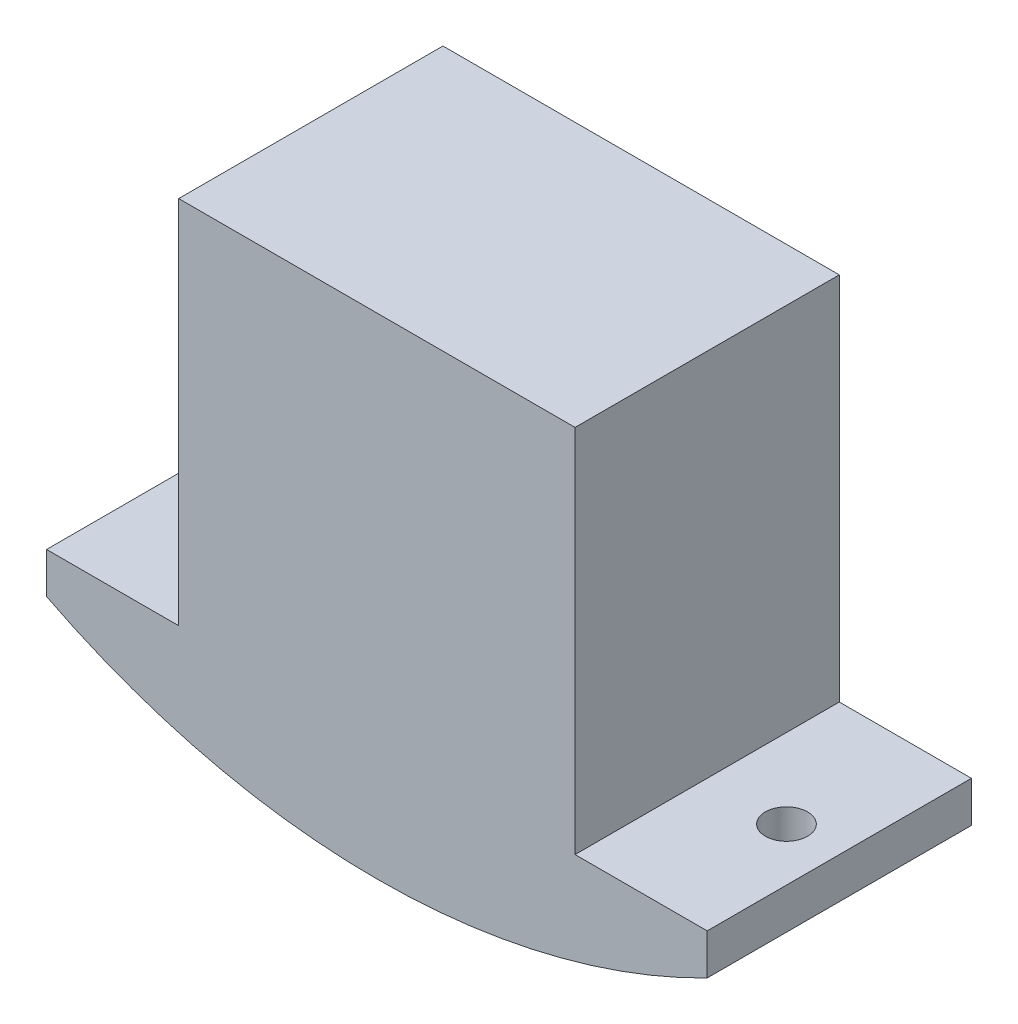
ISO-10303-21;
HEADER;
FILE_DESCRIPTION(('STEP AP214'),'2;1');
FILE_NAME('part.step','',(''),(''),'','','');
FILE_SCHEMA(('AUTOMOTIVE_DESIGN { 1 0 10303 214 1 1 1 1 }'));
ENDSEC;
DATA;
#1=APPLICATION_CONTEXT('core data for automotive mechanical design processes');
#2=APPLICATION_PROTOCOL_DEFINITION('international standard','automotive_design',2000,#1);
#3=PRODUCT_CONTEXT('',#1,'mechanical');
#4=PRODUCT('Part','Part','',(#3));
#5=PRODUCT_RELATED_PRODUCT_CATEGORY('part','',(#4));
#6=PRODUCT_DEFINITION_FORMATION('','',#4);
#7=PRODUCT_DEFINITION_CONTEXT('part definition',#1,'design');
#8=PRODUCT_DEFINITION('design','',#6,#7);
#9=PRODUCT_DEFINITION_SHAPE('','',#8);
#10=(LENGTH_UNIT() NAMED_UNIT(*) SI_UNIT(.MILLI.,.METRE.));
#11=(NAMED_UNIT(*) PLANE_ANGLE_UNIT() SI_UNIT($,.RADIAN.));
#12=(NAMED_UNIT(*) SI_UNIT($,.STERADIAN.) SOLID_ANGLE_UNIT());
#13=UNCERTAINTY_MEASURE_WITH_UNIT(LENGTH_MEASURE(1.E-05),#10,'distance_accuracy_value','');
#14=(GEOMETRIC_REPRESENTATION_CONTEXT(3) GLOBAL_UNCERTAINTY_ASSIGNED_CONTEXT((#13)) GLOBAL_UNIT_ASSIGNED_CONTEXT((#10,
#11,#12)) REPRESENTATION_CONTEXT('',''));
#15=CARTESIAN_POINT('',(0.,0.,0.));
#16=DIRECTION('',(0.,0.,1.));
#17=DIRECTION('',(1.,0.,0.));
#18=AXIS2_PLACEMENT_3D('',#15,#16,#17);
#19=CARTESIAN_POINT('',(-25.,-45.8997948556636,20.));
#20=DIRECTION('',(0.,-1.,0.));
#21=DIRECTION('',(0.,0.,-1.));
#22=AXIS2_PLACEMENT_3D('',#19,#20,#21);
#23=PLANE('',#22);
#24=CARTESIAN_POINT('',(-21.,-45.8997948556636,10.));
#25=DIRECTION('',(0.,1.,0.));
#26=DIRECTION('',(0.,0.,1.));
#27=AXIS2_PLACEMENT_3D('',#24,#25,#26);
#28=CIRCLE('',#27,1.6);
#29=CARTESIAN_POINT('',(-21.,-45.8997948556636,11.6));
#30=VERTEX_POINT('',#29);
#31=EDGE_CURVE('E132',#30,#30,#28,.T.);
#32=ORIENTED_EDGE('',*,*,#31,.F.);
#33=EDGE_LOOP('',(#32));
#34=FACE_BOUND('',#33,.T.);
#35=DIRECTION('',(-1.,0.,0.));
#36=VECTOR('',#35,1.);
#37=CARTESIAN_POINT('',(-25.,-45.8997948556636,0.));
#38=LINE('',#37,#36);
#39=CARTESIAN_POINT('',(-15.,-45.8997948556636,0.));
#40=VERTEX_POINT('',#39);
#41=CARTESIAN_POINT('',(-25.,-45.8997948556636,0.));
#42=VERTEX_POINT('',#41);
#43=EDGE_CURVE('E128',#40,#42,#38,.T.);
#44=ORIENTED_EDGE('',*,*,#43,.T.);
#45=DIRECTION('',(0.,0.,-1.));
#46=VECTOR('',#45,1.);
#47=CARTESIAN_POINT('',(-25.,-45.8997948556636,20.));
#48=LINE('',#47,#46);
#49=CARTESIAN_POINT('',(-25.,-45.8997948556636,20.));
#50=VERTEX_POINT('',#49);
#51=EDGE_CURVE('E11',#50,#42,#48,.T.);
#52=ORIENTED_EDGE('',*,*,#51,.F.);
#53=DIRECTION('',(-1.,0.,0.));
#54=VECTOR('',#53,1.);
#55=CARTESIAN_POINT('',(-25.,-45.8997948556636,20.));
#56=LINE('',#55,#54);
#57=CARTESIAN_POINT('',(-15.,-45.8997948556636,20.));
#58=VERTEX_POINT('',#57);
#59=EDGE_CURVE('E143',#58,#50,#56,.T.);
#60=ORIENTED_EDGE('',*,*,#59,.F.);
#61=DIRECTION('',(0.,0.,-1.));
#62=VECTOR('',#61,1.);
#63=CARTESIAN_POINT('',(-15.,-45.8997948556636,20.));
#64=LINE('',#63,#62);
#65=EDGE_CURVE('E124',#58,#40,#64,.T.);
#66=ORIENTED_EDGE('',*,*,#65,.T.);
#67=EDGE_LOOP('',(#44,#52,#60,#66));
#68=FACE_BOUND('',#67,.T.);
#69=ADVANCED_FACE('F32',(#34,#68),#23,.F.);
#70=CARTESIAN_POINT('',(-25.,-48.9897948556636,20.));
#71=DIRECTION('',(1.,0.,0.));
#72=DIRECTION('',(0.,0.,-1.));
#73=AXIS2_PLACEMENT_3D('',#70,#71,#72);
#74=PLANE('',#73);
#75=DIRECTION('',(0.,-1.,0.));
#76=VECTOR('',#75,1.);
#77=CARTESIAN_POINT('',(-25.,-48.9897948556636,0.));
#78=LINE('',#77,#76);
#79=CARTESIAN_POINT('',(-25.,-48.9897948556636,0.));
#80=VERTEX_POINT('',#79);
#81=EDGE_CURVE('E131',#42,#80,#78,.T.);
#82=ORIENTED_EDGE('',*,*,#81,.T.);
#83=DIRECTION('',(0.,0.,-1.));
#84=VECTOR('',#83,1.);
#85=CARTESIAN_POINT('',(-25.,-48.9897948556636,20.));
#86=LINE('',#85,#84);
#87=CARTESIAN_POINT('',(-25.,-48.9897948556636,20.));
#88=VERTEX_POINT('',#87);
#89=EDGE_CURVE('E40',#88,#80,#86,.T.);
#90=ORIENTED_EDGE('',*,*,#89,.F.);
#91=DIRECTION('',(0.,-1.,0.));
#92=VECTOR('',#91,1.);
#93=CARTESIAN_POINT('',(-25.,-48.9897948556636,20.));
#94=LINE('',#93,#92);
#95=EDGE_CURVE('E91',#50,#88,#94,.T.);
#96=ORIENTED_EDGE('',*,*,#95,.F.);
#97=ORIENTED_EDGE('',*,*,#51,.T.);
#98=EDGE_LOOP('',(#82,#90,#96,#97));
#99=FACE_BOUND('',#98,.T.);
#100=ADVANCED_FACE('F220',(#99),#74,.F.);
#101=CARTESIAN_POINT('',(0.,0.,20.));
#102=DIRECTION('',(0.,0.,-1.));
#103=DIRECTION('',(-1.,0.,0.));
#104=AXIS2_PLACEMENT_3D('',#101,#102,#103);
#105=CYLINDRICAL_SURFACE('',#104,55.);
#106=CARTESIAN_POINT('',(-21.,-50.8330601085553,13.1));
#107=CARTESIAN_POINT('',(-21.1880005553316,-50.7553920460335,13.0999933044631));
#108=CARTESIAN_POINT('',(-21.3757249316982,-50.676607673479,13.0828603278134));
#109=CARTESIAN_POINT('',(-21.7452902366741,-50.5191335969547,13.0149528232306));
#110=CARTESIAN_POINT('',(-21.9271212239294,-50.4404442486739,12.9641242679141));
#111=CARTESIAN_POINT('',(-22.2796942671875,-50.2857065967124,12.8298351191533));
#112=CARTESIAN_POINT('',(-22.4504309833981,-50.2096595728846,12.746358945753));
#113=CARTESIAN_POINT('',(-22.7754484118285,-50.0630676909033,12.5483272717249));
#114=CARTESIAN_POINT('',(-22.9297355686794,-49.9925206808795,12.4337840054007));
#115=CARTESIAN_POINT('',(-23.212059127198,-49.8620475820851,12.1798449291502));
#116=CARTESIAN_POINT('',(-23.3407566596687,-49.8018616784679,12.0413212778889));
#117=CARTESIAN_POINT('',(-23.5723931508888,-49.6926425659666,11.7403396024859));
#118=CARTESIAN_POINT('',(-23.6753475366772,-49.6436026792449,11.5778960059923));
#119=CARTESIAN_POINT('',(-23.8425829556854,-49.5634855135644,11.2492472554569));
#120=CARTESIAN_POINT('',(-23.9095026733124,-49.5311924458572,11.0846834004291));
#121=CARTESIAN_POINT('',(-24.0144911163199,-49.4803766732872,10.7446054441459));
#122=CARTESIAN_POINT('',(-24.0525815423907,-49.4618436110474,10.5690996871245));
#123=CARTESIAN_POINT('',(-24.0957366151136,-49.4408331353126,10.2299366462524));
#124=CARTESIAN_POINT('',(-24.1035588981344,-49.4370152162986,10.0667080514063));
#125=CARTESIAN_POINT('',(-24.0934665362528,-49.441934714723,9.74126128598989));
#126=CARTESIAN_POINT('',(-24.0755581338245,-49.4506690868734,9.57904287992798));
#127=CARTESIAN_POINT('',(-24.0159446414232,-49.479646613924,9.26613029177188));
#128=CARTESIAN_POINT('',(-23.9750996499539,-49.4994737087949,9.11523145100215));
#129=CARTESIAN_POINT('',(-23.8719614516461,-49.549295813995,8.82276067394915));
#130=CARTESIAN_POINT('',(-23.8096655826953,-49.5792920863396,8.68118989790329));
#131=CARTESIAN_POINT('',(-23.6630242970063,-49.6494523551362,8.40510056384761));
#132=CARTESIAN_POINT('',(-23.5778971647339,-49.6899747965998,8.27108996947782));
#133=CARTESIAN_POINT('',(-23.3897864497861,-49.778797669364,8.0191769509117));
#134=CARTESIAN_POINT('',(-23.2867968924547,-49.8271007027444,7.90127994008338));
#135=CARTESIAN_POINT('',(-23.0562537758771,-49.9342232694621,7.67400624722809));
#136=CARTESIAN_POINT('',(-22.9273416735422,-49.9935924510506,7.56626759201561));
#137=CARTESIAN_POINT('',(-22.6555304033656,-50.1173548685673,7.37378895941099));
#138=CARTESIAN_POINT('',(-22.5126255738565,-50.1817501359695,7.28905834417299));
#139=CARTESIAN_POINT('',(-22.2029708666222,-50.3195714361675,7.13727555861048));
#140=CARTESIAN_POINT('',(-22.0352323854852,-50.3932887430233,7.07249939089997));
#141=CARTESIAN_POINT('',(-21.6916687208698,-50.5421268436343,6.97285430707471));
#142=CARTESIAN_POINT('',(-21.5158409322286,-50.6172480848359,6.93799509776872));
#143=CARTESIAN_POINT('',(-21.1513760195531,-50.7706638671181,6.89800426659675));
#144=CARTESIAN_POINT('',(-20.9625442389504,-50.8489237298817,6.89448773833377));
#145=CARTESIAN_POINT('',(-20.5861436227394,-51.0024706492462,6.92196009852178));
#146=CARTESIAN_POINT('',(-20.3985748551457,-51.0777575467952,6.95295083051037));
#147=CARTESIAN_POINT('',(-20.0316809334992,-51.2227528069683,7.04905742498432));
#148=CARTESIAN_POINT('',(-19.8523075140372,-51.2924963298674,7.11393442260001));
#149=CARTESIAN_POINT('',(-19.5064467663301,-51.4250214628812,7.27680349871263));
#150=CARTESIAN_POINT('',(-19.3399557530705,-51.4878050661223,7.37478606399608));
#151=CARTESIAN_POINT('',(-19.0344005153011,-51.6015195567654,7.59581927967318));
#152=CARTESIAN_POINT('',(-18.8943535429527,-51.6529005814896,7.71727761166198));
#153=CARTESIAN_POINT('',(-18.636793285317,-51.7463886703328,7.98512406303934));
#154=CARTESIAN_POINT('',(-18.5192703646194,-51.7884997011497,8.13150147163716));
#155=CARTESIAN_POINT('',(-18.3186122832657,-51.8598020141061,8.43444861314598));
#156=CARTESIAN_POINT('',(-18.233706623123,-51.889667572203,8.58968780535117));
#157=CARTESIAN_POINT('',(-18.0911829716268,-51.939530614033,8.91369009464537));
#158=CARTESIAN_POINT('',(-18.0335554983919,-51.9595315268124,9.08244846859039));
#159=CARTESIAN_POINT('',(-17.9502357354832,-51.9883726036303,9.41911323616182));
#160=CARTESIAN_POINT('',(-17.9230275300034,-51.9977429334181,9.58660042013892));
#161=CARTESIAN_POINT('',(-17.8963166342662,-52.0069424597295,9.92401890421695));
#162=CARTESIAN_POINT('',(-17.8968089300155,-52.0067733829554,10.093949756429));
#163=CARTESIAN_POINT('',(-17.9251193153286,-51.9970220179387,10.4270548517473));
#164=CARTESIAN_POINT('',(-17.9522728442856,-51.9876686577681,10.5902929240702));
#165=CARTESIAN_POINT('',(-18.031906183117,-51.9601012066274,10.9096730841036));
#166=CARTESIAN_POINT('',(-18.0843857233914,-51.9418872099803,11.065815247332));
#167=CARTESIAN_POINT('',(-18.2132048538323,-51.8968575730114,11.3678092060371));
#168=CARTESIAN_POINT('',(-18.2896995227267,-51.8699859955174,11.5135863430243));
#169=CARTESIAN_POINT('',(-18.4637783400796,-51.8082752988828,11.7900488465414));
#170=CARTESIAN_POINT('',(-18.5613641372207,-51.7734355568625,11.9207330320371));
#171=CARTESIAN_POINT('',(-18.7781724725445,-51.695202294207,12.1682903556516));
#172=CARTESIAN_POINT('',(-18.8980272767727,-51.6515543314649,12.2845284740939));
#173=CARTESIAN_POINT('',(-19.1531815384227,-51.5574835852272,12.4953301218378));
#174=CARTESIAN_POINT('',(-19.2884883813723,-51.5070575600019,12.5898832209692));
#175=CARTESIAN_POINT('',(-19.5785844427872,-51.397513376809,12.7603366758791));
#176=CARTESIAN_POINT('',(-19.7340419750428,-51.3380654473083,12.8348848480948));
#177=CARTESIAN_POINT('',(-20.0532357042321,-51.2142262627779,12.9568212882241));
#178=CARTESIAN_POINT('',(-20.2169646235016,-51.1498393283834,13.0042329946312));
#179=CARTESIAN_POINT('',(-20.4846278585339,-51.0430420149682,13.0586330566419));
#180=CARTESIAN_POINT('',(-20.587339651689,-51.0017038893481,13.07415530034));
#181=CARTESIAN_POINT('',(-20.7933954003077,-50.918042806554,13.0948406410067));
#182=CARTESIAN_POINT('',(-20.8967393594538,-50.8757198436388,13.1000036775712));
#183=CARTESIAN_POINT('',(-21.,-50.8330601085553,13.1));
#184=B_SPLINE_CURVE_WITH_KNOTS('',3,(#106,#107,#108,#109,#110,#111,#112,#113,#114,#115,#116,
#117,#118,#119,#120,#121,#122,#123,#124,#125,#126,#127,#128,#129,#130,#131,#132,#133,#134,#135,
#136,#137,#138,#139,#140,#141,#142,#143,#144,#145,#146,#147,#148,#149,#150,#151,#152,#153,#154,
#155,#156,#157,#158,#159,#160,#161,#162,#163,#164,#165,#166,#167,#168,#169,#170,#171,#172,#173,
#174,#175,#176,#177,#178,#179,#180,#181,#182,#183),.UNSPECIFIED.,.T.,.F.,(4,2,2,2,2,2,2,2,2,2,2,
2,2,2,2,2,2,2,2,2,2,2,2,2,2,2,2,2,2,2,2,2,2,2,2,2,2,2,4),(0.,0.609831568960383,1.22064331257064,
1.83174690150622,2.44261018476417,3.03469640998915,3.62642696200632,4.1651359314897,
4.7034389938409,5.19135414318091,5.67915094031112,6.14977211438869,6.62045171489747,
7.10994214682858,7.59959662126277,8.13192512186627,8.66446990767516,9.24492147859417,
9.82556131078311,10.4359588446578,11.0463889903597,11.6525731438991,12.2585832523469,
12.8326719641952,13.4065145397022,13.9420915540091,14.4774822651092,14.9848031323611,
15.4920321711206,15.986930849839,16.4818242603881,16.9799815836662,17.4781778617371,
17.9936271521462,18.5093238484259,19.054095270067,19.598395445178,19.9333478135046,
20.2683021349165),.UNSPECIFIED.);
#185=CARTESIAN_POINT('',(-21.,-50.8330601085553,13.1));
#186=VERTEX_POINT('',#185);
#187=EDGE_CURVE('E187',#186,#186,#184,.T.);
#188=ORIENTED_EDGE('',*,*,#187,.F.);
#189=EDGE_LOOP('',(#188));
#190=FACE_BOUND('',#189,.T.);
#191=CARTESIAN_POINT('',(21.,-50.8330601085553,13.1));
#192=CARTESIAN_POINT('',(20.8177146204358,-50.9083637547193,13.0999938373069));
#193=CARTESIAN_POINT('',(20.6348977223595,-50.9827306898791,13.0838901418377));
#194=CARTESIAN_POINT('',(20.273311622882,-51.1275940003155,13.019223263897));
#195=CARTESIAN_POINT('',(20.0945468716768,-51.1980862308243,12.9706260272636));
#196=CARTESIAN_POINT('',(19.7462539582834,-51.3334239956548,12.8412462182303));
#197=CARTESIAN_POINT('',(19.5767444761655,-51.398258257448,12.7604011047474));
#198=CARTESIAN_POINT('',(19.2531997896221,-51.5203281509274,12.567895683877));
#199=CARTESIAN_POINT('',(19.0991575642722,-51.5775672340586,12.4562494448284));
#200=CARTESIAN_POINT('',(18.8194422838864,-51.680264600876,12.2108973796841));
#201=CARTESIAN_POINT('',(18.6927488472437,-51.7261627813463,12.0785409031254));
#202=CARTESIAN_POINT('',(18.4635813712355,-51.8084069272884,11.7917127159057));
#203=CARTESIAN_POINT('',(18.3610983324015,-51.8447564427463,11.6372492572277));
#204=CARTESIAN_POINT('',(18.1904039179595,-51.9048831441195,11.3214690785874));
#205=CARTESIAN_POINT('',(18.1204019648644,-51.9293224229049,11.1612451814627));
#206=CARTESIAN_POINT('',(18.0081397201886,-51.9683603028427,10.8302309727614));
#207=CARTESIAN_POINT('',(17.9658707731008,-51.9829619743632,10.659443976169));
#208=CARTESIAN_POINT('',(17.9120769014418,-52.0015218319718,10.3206268955279));
#209=CARTESIAN_POINT('',(17.8992283009696,-52.0059383375317,10.1528308445719));
#210=CARTESIAN_POINT('',(17.9008431792208,-52.0053825948392,9.81739748649115));
#211=CARTESIAN_POINT('',(17.9153028798965,-52.0004116453222,9.64976016061732));
#212=CARTESIAN_POINT('',(17.970511345467,-51.9813576141218,9.32226146213378));
#213=CARTESIAN_POINT('',(18.0108260432156,-51.9674249747952,9.1623177337564));
#214=CARTESIAN_POINT('',(18.1158499412313,-51.9309064957742,8.85171524524056));
#215=CARTESIAN_POINT('',(18.1805597175655,-51.9083204517373,8.70105670446097));
#216=CARTESIAN_POINT('',(18.3331839284378,-51.8546138040551,8.41086493695801));
#217=CARTESIAN_POINT('',(18.4214149994431,-51.8233764980107,8.2715201971099));
#218=CARTESIAN_POINT('',(18.6176423966222,-51.7532049633925,8.00973693938558));
#219=CARTESIAN_POINT('',(18.7256417595163,-51.7142695521949,7.88730102404757));
#220=CARTESIAN_POINT('',(18.9627977469742,-51.6277913435134,7.6573101133388));
#221=CARTESIAN_POINT('',(19.0926407271465,-51.5799608934124,7.55057197230411));
#222=CARTESIAN_POINT('',(19.3660678540002,-51.4779244636859,7.36029695277776));
#223=CARTESIAN_POINT('',(19.5096554355556,-51.4237168895926,7.27676589436162));
#224=CARTESIAN_POINT('',(19.8154137569849,-51.3067022526693,7.12994882244971));
#225=CARTESIAN_POINT('',(19.9781818196429,-51.2435754848166,7.06816232115972));
#226=CARTESIAN_POINT('',(20.3100893508858,-51.1129348411333,6.97281221912019));
#227=CARTESIAN_POINT('',(20.4792307311093,-51.0454196445455,6.93925715776968));
#228=CARTESIAN_POINT('',(20.8301791372671,-50.9032575479516,6.89931464175235));
#229=CARTESIAN_POINT('',(21.0121200838805,-50.8284281862208,6.89474496400945));
#230=CARTESIAN_POINT('',(21.3735287632949,-50.6775163285057,6.91726061301757));
#231=CARTESIAN_POINT('',(21.5529957749111,-50.6014334807324,6.94435498074311));
#232=CARTESIAN_POINT('',(21.9118336682774,-50.44711256262,7.03116781229566));
#233=CARTESIAN_POINT('',(22.0909185029272,-50.3689086740101,7.09213742031164));
#234=CARTESIAN_POINT('',(22.4363239117846,-50.2160041258121,7.2463216430235));
#235=CARTESIAN_POINT('',(22.602643044644,-50.1413038621802,7.33953989232021));
#236=CARTESIAN_POINT('',(22.915373835001,-49.9991482180977,7.55521159032609));
#237=CARTESIAN_POINT('',(23.0619978384442,-49.9316175448822,7.67730591111091));
#238=CARTESIAN_POINT('',(23.332228931922,-49.8059166253258,7.94882038991483));
#239=CARTESIAN_POINT('',(23.4558464650816,-49.7477421336526,8.09822808846115));
#240=CARTESIAN_POINT('',(23.6664644223678,-49.6478708831381,8.40861615614873));
#241=CARTESIAN_POINT('',(23.7554966648062,-49.6052737298762,8.56792367820013));
#242=CARTESIAN_POINT('',(23.9048797642091,-49.5334599655669,8.90222676033077));
#243=CARTESIAN_POINT('',(23.9652544384652,-49.5042322439275,9.077209148735));
#244=CARTESIAN_POINT('',(24.0496010373927,-49.4633062578903,9.41884550480504));
#245=CARTESIAN_POINT('',(24.0766146392171,-49.4501448521164,9.58457683560136));
#246=CARTESIAN_POINT('',(24.103457217653,-49.4370670415841,9.91872217480521));
#247=CARTESIAN_POINT('',(24.1032975385977,-49.4371451095946,10.0871350343629));
#248=CARTESIAN_POINT('',(24.0766619617946,-49.4501215513358,10.411060908857));
#249=CARTESIAN_POINT('',(24.0517732425367,-49.4622467083548,10.5667394960989));
#250=CARTESIAN_POINT('',(23.9791397764522,-49.497499626361,10.8713453962786));
#251=CARTESIAN_POINT('',(23.9313944841634,-49.5206276499267,11.0202725480036));
#252=CARTESIAN_POINT('',(23.8140626309036,-49.5771590305628,11.3099052598458));
#253=CARTESIAN_POINT('',(23.7441484533049,-49.6107163559399,11.4504472600299));
#254=CARTESIAN_POINT('',(23.5852685545045,-49.68644516298,11.7177248259096));
#255=CARTESIAN_POINT('',(23.4962983657449,-49.7286186645423,11.8444571434848));
#256=CARTESIAN_POINT('',(23.2947154026186,-49.8233832800688,12.0908090822915));
#257=CARTESIAN_POINT('',(23.1808259490629,-49.8765200546143,12.2091723280897));
#258=CARTESIAN_POINT('',(22.9375587444067,-49.9888623021631,12.4253619042037));
#259=CARTESIAN_POINT('',(22.8081712560649,-50.0480715870629,12.5231752158289));
#260=CARTESIAN_POINT('',(22.5243799124363,-50.1764762873152,12.7050495703799));
#261=CARTESIAN_POINT('',(22.368767375975,-50.2460864192683,12.7869317126073));
#262=CARTESIAN_POINT('',(22.0471794406559,-50.3880214590645,12.9229895658875));
#263=CARTESIAN_POINT('',(21.8812116213038,-50.4603443661916,12.9771852810341));
#264=CARTESIAN_POINT('',(21.5955675679756,-50.5830764108585,13.0446105990954));
#265=CARTESIAN_POINT('',(21.477530183101,-50.6333124911695,13.0653366206773));
#266=CARTESIAN_POINT('',(21.2397386899615,-50.7335210394677,13.0930337290338));
#267=CARTESIAN_POINT('',(21.1199844872874,-50.7834934927496,13.1000040564283));
#268=CARTESIAN_POINT('',(21.,-50.8330601085553,13.1));
#269=B_SPLINE_CURVE_WITH_KNOTS('',3,(#191,#192,#193,#194,#195,#196,#197,#198,#199,#200,#201,
#202,#203,#204,#205,#206,#207,#208,#209,#210,#211,#212,#213,#214,#215,#216,#217,#218,#219,#220,
#221,#222,#223,#224,#225,#226,#227,#228,#229,#230,#231,#232,#233,#234,#235,#236,#237,#238,#239,
#240,#241,#242,#243,#244,#245,#246,#247,#248,#249,#250,#251,#252,#253,#254,#255,#256,#257,#258,
#259,#260,#261,#262,#263,#264,#265,#266,#267,#268),.UNSPECIFIED.,.T.,.F.,(4,2,2,2,2,2,2,2,2,2,2,
2,2,2,2,2,2,2,2,2,2,2,2,2,2,2,2,2,2,2,2,2,2,2,2,2,2,2,4),(0.,0.59123245222107,1.18308550624546,
1.77609201648371,2.36882811959488,2.93251355941588,3.49598913569947,4.0229487002775,
4.54974372176108,5.05232790628497,5.55484256440525,6.04913405625853,6.54343722107877,
7.04476361806098,7.54616709139142,8.06814665124331,8.5902569997778,9.14341926934763,
9.69674879842828,10.2844624542546,10.8723439598479,11.4835387180343,12.0948023837158,
12.6988303340908,13.3025834310486,13.8616890441259,14.420329167635,14.9229869814749,
15.4254349456566,15.8975904508564,16.3697572244062,16.8492552862949,17.3288658866764,
17.8446315289568,18.3607229377274,18.9256780057072,19.490224301,19.8793658053007,
20.2685287914768),.UNSPECIFIED.);
#270=CARTESIAN_POINT('',(21.,-50.8330601085553,13.1));
#271=VERTEX_POINT('',#270);
#272=EDGE_CURVE('E188',#271,#271,#269,.T.);
#273=ORIENTED_EDGE('',*,*,#272,.F.);
#274=EDGE_LOOP('',(#273));
#275=FACE_BOUND('',#274,.T.);
#276=CARTESIAN_POINT('',(0.,0.,0.));
#277=DIRECTION('',(0.,0.,1.));
#278=DIRECTION('',(1.,0.,0.));
#279=AXIS2_PLACEMENT_3D('',#276,#277,#278);
#280=CIRCLE('',#279,55.);
#281=CARTESIAN_POINT('',(25.,-48.9897948556636,0.));
#282=VERTEX_POINT('',#281);
#283=EDGE_CURVE('E134',#80,#282,#280,.T.);
#284=ORIENTED_EDGE('',*,*,#283,.T.);
#285=DIRECTION('',(0.,0.,-1.));
#286=VECTOR('',#285,1.);
#287=CARTESIAN_POINT('',(25.,-48.9897948556636,20.));
#288=LINE('',#287,#286);
#289=CARTESIAN_POINT('',(25.,-48.9897948556636,20.));
#290=VERTEX_POINT('',#289);
#291=EDGE_CURVE('E150',#290,#282,#288,.T.);
#292=ORIENTED_EDGE('',*,*,#291,.F.);
#293=CARTESIAN_POINT('',(0.,0.,20.));
#294=DIRECTION('',(0.,0.,1.));
#295=DIRECTION('',(1.,0.,0.));
#296=AXIS2_PLACEMENT_3D('',#293,#294,#295);
#297=CIRCLE('',#296,55.);
#298=EDGE_CURVE('E158',#88,#290,#297,.T.);
#299=ORIENTED_EDGE('',*,*,#298,.F.);
#300=ORIENTED_EDGE('',*,*,#89,.T.);
#301=EDGE_LOOP('',(#284,#292,#299,#300));
#302=FACE_BOUND('',#301,.T.);
#303=ADVANCED_FACE('F156',(#190,#275,#302),#105,.T.);
#304=CARTESIAN_POINT('',(25.,-48.9897948556636,20.));
#305=DIRECTION('',(-1.,0.,0.));
#306=DIRECTION('',(0.,0.,1.));
#307=AXIS2_PLACEMENT_3D('',#304,#305,#306);
#308=PLANE('',#307);
#309=DIRECTION('',(0.,1.,0.));
#310=VECTOR('',#309,1.);
#311=CARTESIAN_POINT('',(25.,-48.9897948556636,0.));
#312=LINE('',#311,#310);
#313=CARTESIAN_POINT('',(25.,-45.8997948556636,0.));
#314=VERTEX_POINT('',#313);
#315=EDGE_CURVE('E136',#282,#314,#312,.T.);
#316=ORIENTED_EDGE('',*,*,#315,.T.);
#317=DIRECTION('',(0.,0.,-1.));
#318=VECTOR('',#317,1.);
#319=CARTESIAN_POINT('',(25.,-45.8997948556636,20.));
#320=LINE('',#319,#318);
#321=CARTESIAN_POINT('',(25.,-45.8997948556636,20.));
#322=VERTEX_POINT('',#321);
#323=EDGE_CURVE('E147',#322,#314,#320,.T.);
#324=ORIENTED_EDGE('',*,*,#323,.F.);
#325=DIRECTION('',(0.,1.,0.));
#326=VECTOR('',#325,1.);
#327=CARTESIAN_POINT('',(25.,-48.9897948556636,20.));
#328=LINE('',#327,#326);
#329=EDGE_CURVE('E170',#290,#322,#328,.T.);
#330=ORIENTED_EDGE('',*,*,#329,.F.);
#331=ORIENTED_EDGE('',*,*,#291,.T.);
#332=EDGE_LOOP('',(#316,#324,#330,#331));
#333=FACE_BOUND('',#332,.T.);
#334=ADVANCED_FACE('F166',(#333),#308,.F.);
#335=CARTESIAN_POINT('',(25.,-45.8997948556636,20.));
#336=DIRECTION('',(0.,-1.,0.));
#337=DIRECTION('',(0.,0.,-1.));
#338=AXIS2_PLACEMENT_3D('',#335,#336,#337);
#339=PLANE('',#338);
#340=CARTESIAN_POINT('',(21.,-45.8997948556636,10.));
#341=DIRECTION('',(0.,1.,0.));
#342=DIRECTION('',(0.,0.,1.));
#343=AXIS2_PLACEMENT_3D('',#340,#341,#342);
#344=CIRCLE('',#343,1.6);
#345=CARTESIAN_POINT('',(21.,-45.8997948556636,11.6));
#346=VERTEX_POINT('',#345);
#347=EDGE_CURVE('E176',#346,#346,#344,.T.);
#348=ORIENTED_EDGE('',*,*,#347,.F.);
#349=EDGE_LOOP('',(#348));
#350=FACE_BOUND('',#349,.T.);
#351=DIRECTION('',(-1.,0.,0.));
#352=VECTOR('',#351,1.);
#353=CARTESIAN_POINT('',(25.,-45.8997948556636,0.));
#354=LINE('',#353,#352);
#355=CARTESIAN_POINT('',(15.,-45.8997948556636,0.));
#356=VERTEX_POINT('',#355);
#357=EDGE_CURVE('E138',#314,#356,#354,.T.);
#358=ORIENTED_EDGE('',*,*,#357,.T.);
#359=DIRECTION('',(0.,0.,-1.));
#360=VECTOR('',#359,1.);
#361=CARTESIAN_POINT('',(15.,-45.8997948556636,20.));
#362=LINE('',#361,#360);
#363=CARTESIAN_POINT('',(15.,-45.8997948556636,20.));
#364=VERTEX_POINT('',#363);
#365=EDGE_CURVE('E119',#364,#356,#362,.T.);
#366=ORIENTED_EDGE('',*,*,#365,.F.);
#367=DIRECTION('',(-1.,0.,0.));
#368=VECTOR('',#367,1.);
#369=CARTESIAN_POINT('',(25.,-45.8997948556636,20.));
#370=LINE('',#369,#368);
#371=EDGE_CURVE('E110',#322,#364,#370,.T.);
#372=ORIENTED_EDGE('',*,*,#371,.F.);
#373=ORIENTED_EDGE('',*,*,#323,.T.);
#374=EDGE_LOOP('',(#358,#366,#372,#373));
#375=FACE_BOUND('',#374,.T.);
#376=ADVANCED_FACE('F169',(#350,#375),#339,.F.);
#377=CARTESIAN_POINT('',(15.,-17.8997948556636,20.));
#378=DIRECTION('',(-1.,0.,0.));
#379=DIRECTION('',(0.,-1.,0.));
#380=AXIS2_PLACEMENT_3D('',#377,#378,#379);
#381=PLANE('',#380);
#382=DIRECTION('',(0.,1.,0.));
#383=VECTOR('',#382,1.);
#384=CARTESIAN_POINT('',(15.,-17.8997948556636,0.));
#385=LINE('',#384,#383);
#386=CARTESIAN_POINT('',(15.,-17.8997948556636,0.));
#387=VERTEX_POINT('',#386);
#388=EDGE_CURVE('E118',#356,#387,#385,.T.);
#389=ORIENTED_EDGE('',*,*,#388,.T.);
#390=DIRECTION('',(0.,0.,-1.));
#391=VECTOR('',#390,1.);
#392=CARTESIAN_POINT('',(15.,-17.8997948556636,20.));
#393=LINE('',#392,#391);
#394=CARTESIAN_POINT('',(15.,-17.8997948556636,20.));
#395=VERTEX_POINT('',#394);
#396=EDGE_CURVE('E115',#395,#387,#393,.T.);
#397=ORIENTED_EDGE('',*,*,#396,.F.);
#398=DIRECTION('',(0.,1.,0.));
#399=VECTOR('',#398,1.);
#400=CARTESIAN_POINT('',(15.,-17.8997948556636,20.));
#401=LINE('',#400,#399);
#402=EDGE_CURVE('E104',#364,#395,#401,.T.);
#403=ORIENTED_EDGE('',*,*,#402,.F.);
#404=ORIENTED_EDGE('',*,*,#365,.T.);
#405=EDGE_LOOP('',(#389,#397,#403,#404));
#406=FACE_BOUND('',#405,.T.);
#407=ADVANCED_FACE('F116',(#406),#381,.F.);
#408=CARTESIAN_POINT('',(-15.,-17.8997948556636,20.));
#409=DIRECTION('',(0.,-1.,0.));
#410=DIRECTION('',(0.,0.,-1.));
#411=AXIS2_PLACEMENT_3D('',#408,#409,#410);
#412=PLANE('',#411);
#413=DIRECTION('',(-1.,0.,0.));
#414=VECTOR('',#413,1.);
#415=CARTESIAN_POINT('',(-15.,-17.8997948556636,0.));
#416=LINE('',#415,#414);
#417=CARTESIAN_POINT('',(-15.,-17.8997948556636,0.));
#418=VERTEX_POINT('',#417);
#419=EDGE_CURVE('E77',#387,#418,#416,.T.);
#420=ORIENTED_EDGE('',*,*,#419,.T.);
#421=DIRECTION('',(0.,0.,-1.));
#422=VECTOR('',#421,1.);
#423=CARTESIAN_POINT('',(-15.,-17.8997948556636,20.));
#424=LINE('',#423,#422);
#425=CARTESIAN_POINT('',(-15.,-17.8997948556636,20.));
#426=VERTEX_POINT('',#425);
#427=EDGE_CURVE('E120',#426,#418,#424,.T.);
#428=ORIENTED_EDGE('',*,*,#427,.F.);
#429=DIRECTION('',(-1.,0.,0.));
#430=VECTOR('',#429,1.);
#431=CARTESIAN_POINT('',(-15.,-17.8997948556636,20.));
#432=LINE('',#431,#430);
#433=EDGE_CURVE('E108',#395,#426,#432,.T.);
#434=ORIENTED_EDGE('',*,*,#433,.F.);
#435=ORIENTED_EDGE('',*,*,#396,.T.);
#436=EDGE_LOOP('',(#420,#428,#434,#435));
#437=FACE_BOUND('',#436,.T.);
#438=ADVANCED_FACE('F122',(#437),#412,.F.);
#439=CARTESIAN_POINT('',(-15.,-45.8997948556636,20.));
#440=DIRECTION('',(1.,0.,0.));
#441=DIRECTION('',(0.,1.,0.));
#442=AXIS2_PLACEMENT_3D('',#439,#440,#441);
#443=PLANE('',#442);
#444=DIRECTION('',(0.,-1.,0.));
#445=VECTOR('',#444,1.);
#446=CARTESIAN_POINT('',(-15.,-45.8997948556636,0.));
#447=LINE('',#446,#445);
#448=EDGE_CURVE('E83',#418,#40,#447,.T.);
#449=ORIENTED_EDGE('',*,*,#448,.T.);
#450=ORIENTED_EDGE('',*,*,#65,.F.);
#451=DIRECTION('',(0.,-1.,0.));
#452=VECTOR('',#451,1.);
#453=CARTESIAN_POINT('',(-15.,-45.8997948556636,20.));
#454=LINE('',#453,#452);
#455=EDGE_CURVE('E48',#426,#58,#454,.T.);
#456=ORIENTED_EDGE('',*,*,#455,.F.);
#457=ORIENTED_EDGE('',*,*,#427,.T.);
#458=EDGE_LOOP('',(#449,#450,#456,#457));
#459=FACE_BOUND('',#458,.T.);
#460=ADVANCED_FACE('F229',(#459),#443,.F.);
#461=CARTESIAN_POINT('',(0.,0.,20.));
#462=DIRECTION('',(0.,0.,1.));
#463=DIRECTION('',(1.,0.,0.));
#464=AXIS2_PLACEMENT_3D('',#461,#462,#463);
#465=PLANE('',#464);
#466=ORIENTED_EDGE('',*,*,#59,.T.);
#467=ORIENTED_EDGE('',*,*,#95,.T.);
#468=ORIENTED_EDGE('',*,*,#298,.T.);
#469=ORIENTED_EDGE('',*,*,#329,.T.);
#470=ORIENTED_EDGE('',*,*,#371,.T.);
#471=ORIENTED_EDGE('',*,*,#402,.T.);
#472=ORIENTED_EDGE('',*,*,#433,.T.);
#473=ORIENTED_EDGE('',*,*,#455,.T.);
#474=EDGE_LOOP('',(#466,#467,#468,#469,#470,#471,#472,#473));
#475=FACE_BOUND('',#474,.T.);
#476=ADVANCED_FACE('F106',(#475),#465,.T.);
#477=CARTESIAN_POINT('',(0.,0.,0.));
#478=DIRECTION('',(0.,0.,1.));
#479=DIRECTION('',(1.,0.,0.));
#480=AXIS2_PLACEMENT_3D('',#477,#478,#479);
#481=PLANE('',#480);
#482=ORIENTED_EDGE('',*,*,#43,.F.);
#483=ORIENTED_EDGE('',*,*,#448,.F.);
#484=ORIENTED_EDGE('',*,*,#419,.F.);
#485=ORIENTED_EDGE('',*,*,#388,.F.);
#486=ORIENTED_EDGE('',*,*,#357,.F.);
#487=ORIENTED_EDGE('',*,*,#315,.F.);
#488=ORIENTED_EDGE('',*,*,#283,.F.);
#489=ORIENTED_EDGE('',*,*,#81,.F.);
#490=EDGE_LOOP('',(#482,#483,#484,#485,#486,#487,#488,#489));
#491=FACE_BOUND('',#490,.T.);
#492=ADVANCED_FACE('F162',(#491),#481,.F.);
#493=CARTESIAN_POINT('',(21.,-48.3997948556636,10.));
#494=DIRECTION('',(0.,1.,0.));
#495=DIRECTION('',(0.,0.,1.));
#496=AXIS2_PLACEMENT_3D('',#493,#494,#495);
#497=CYLINDRICAL_SURFACE('',#496,1.6);
#498=CARTESIAN_POINT('',(21.,-48.3997948556636,10.));
#499=DIRECTION('',(0.,1.,0.));
#500=DIRECTION('',(0.,0.,1.));
#501=AXIS2_PLACEMENT_3D('',#498,#499,#500);
#502=CIRCLE('',#501,1.6);
#503=CARTESIAN_POINT('',(21.,-48.3997948556636,11.6));
#504=VERTEX_POINT('',#503);
#505=EDGE_CURVE('E179',#504,#504,#502,.T.);
#506=ORIENTED_EDGE('',*,*,#505,.F.);
#507=EDGE_LOOP('',(#506));
#508=FACE_BOUND('',#507,.T.);
#509=ORIENTED_EDGE('',*,*,#347,.T.);
#510=EDGE_LOOP('',(#509));
#511=FACE_BOUND('',#510,.T.);
#512=ADVANCED_FACE('F273',(#508,#511),#497,.F.);
#513=CARTESIAN_POINT('',(-21.,-48.3997948556636,10.));
#514=DIRECTION('',(0.,1.,0.));
#515=DIRECTION('',(0.,0.,1.));
#516=AXIS2_PLACEMENT_3D('',#513,#514,#515);
#517=CYLINDRICAL_SURFACE('',#516,1.6);
#518=CARTESIAN_POINT('',(-21.,-48.3997948556636,10.));
#519=DIRECTION('',(0.,1.,0.));
#520=DIRECTION('',(0.,0.,1.));
#521=AXIS2_PLACEMENT_3D('',#518,#519,#520);
#522=CIRCLE('',#521,1.6);
#523=CARTESIAN_POINT('',(-21.,-48.3997948556636,11.6));
#524=VERTEX_POINT('',#523);
#525=EDGE_CURVE('E182',#524,#524,#522,.T.);
#526=ORIENTED_EDGE('',*,*,#525,.F.);
#527=EDGE_LOOP('',(#526));
#528=FACE_BOUND('',#527,.T.);
#529=ORIENTED_EDGE('',*,*,#31,.T.);
#530=EDGE_LOOP('',(#529));
#531=FACE_BOUND('',#530,.T.);
#532=ADVANCED_FACE('F216',(#528,#531),#517,.F.);
#533=CARTESIAN_POINT('',(21.,-55.001,10.));
#534=DIRECTION('',(0.,1.,0.));
#535=DIRECTION('',(0.,0.,1.));
#536=AXIS2_PLACEMENT_3D('',#533,#534,#535);
#537=CYLINDRICAL_SURFACE('',#536,3.1);
#538=CARTESIAN_POINT('',(21.,-48.3997948556636,10.));
#539=DIRECTION('',(0.,1.,0.));
#540=DIRECTION('',(0.,0.,1.));
#541=AXIS2_PLACEMENT_3D('',#538,#539,#540);
#542=CIRCLE('',#541,3.1);
#543=CARTESIAN_POINT('',(21.,-48.3997948556636,13.1));
#544=VERTEX_POINT('',#543);
#545=EDGE_CURVE('E196',#544,#544,#542,.T.);
#546=ORIENTED_EDGE('',*,*,#545,.T.);
#547=EDGE_LOOP('',(#546));
#548=FACE_BOUND('',#547,.T.);
#549=ORIENTED_EDGE('',*,*,#272,.T.);
#550=EDGE_LOOP('',(#549));
#551=FACE_BOUND('',#550,.T.);
#552=ADVANCED_FACE('F198',(#548,#551),#537,.F.);
#553=CARTESIAN_POINT('',(21.,-48.3997948556636,10.));
#554=DIRECTION('',(0.,1.,0.));
#555=DIRECTION('',(0.,0.,1.));
#556=AXIS2_PLACEMENT_3D('',#553,#554,#555);
#557=PLANE('',#556);
#558=ORIENTED_EDGE('',*,*,#505,.T.);
#559=EDGE_LOOP('',(#558));
#560=FACE_BOUND('',#559,.T.);
#561=ORIENTED_EDGE('',*,*,#545,.F.);
#562=EDGE_LOOP('',(#561));
#563=FACE_BOUND('',#562,.T.);
#564=ADVANCED_FACE('F207',(#560,#563),#557,.F.);
#565=CARTESIAN_POINT('',(-21.,-55.001,10.));
#566=DIRECTION('',(0.,1.,0.));
#567=DIRECTION('',(0.,0.,1.));
#568=AXIS2_PLACEMENT_3D('',#565,#566,#567);
#569=CYLINDRICAL_SURFACE('',#568,3.1);
#570=CARTESIAN_POINT('',(-21.,-48.3997948556636,10.));
#571=DIRECTION('',(0.,1.,0.));
#572=DIRECTION('',(0.,0.,1.));
#573=AXIS2_PLACEMENT_3D('',#570,#571,#572);
#574=CIRCLE('',#573,3.1);
#575=CARTESIAN_POINT('',(-21.,-48.3997948556636,13.1));
#576=VERTEX_POINT('',#575);
#577=EDGE_CURVE('E195',#576,#576,#574,.T.);
#578=ORIENTED_EDGE('',*,*,#577,.T.);
#579=EDGE_LOOP('',(#578));
#580=FACE_BOUND('',#579,.T.);
#581=ORIENTED_EDGE('',*,*,#187,.T.);
#582=EDGE_LOOP('',(#581));
#583=FACE_BOUND('',#582,.T.);
#584=ADVANCED_FACE('F204',(#580,#583),#569,.F.);
#585=CARTESIAN_POINT('',(-21.,-48.3997948556636,10.));
#586=DIRECTION('',(0.,1.,0.));
#587=DIRECTION('',(0.,0.,1.));
#588=AXIS2_PLACEMENT_3D('',#585,#586,#587);
#589=PLANE('',#588);
#590=ORIENTED_EDGE('',*,*,#525,.T.);
#591=EDGE_LOOP('',(#590));
#592=FACE_BOUND('',#591,.T.);
#593=ORIENTED_EDGE('',*,*,#577,.F.);
#594=EDGE_LOOP('',(#593));
#595=FACE_BOUND('',#594,.T.);
#596=ADVANCED_FACE('F214',(#592,#595),#589,.F.);
#597=CLOSED_SHELL('',(#69,#100,#303,#334,#376,#407,#438,#460,#476,#492,#512,#532,#552,#564,#584,#596));
#598=MANIFOLD_SOLID_BREP('B2',#597);
#599=ADVANCED_BREP_SHAPE_REPRESENTATION('',(#18,#598),#14);
#600=SHAPE_DEFINITION_REPRESENTATION(#9,#599);
ENDSEC;
END-ISO-10303-21;
